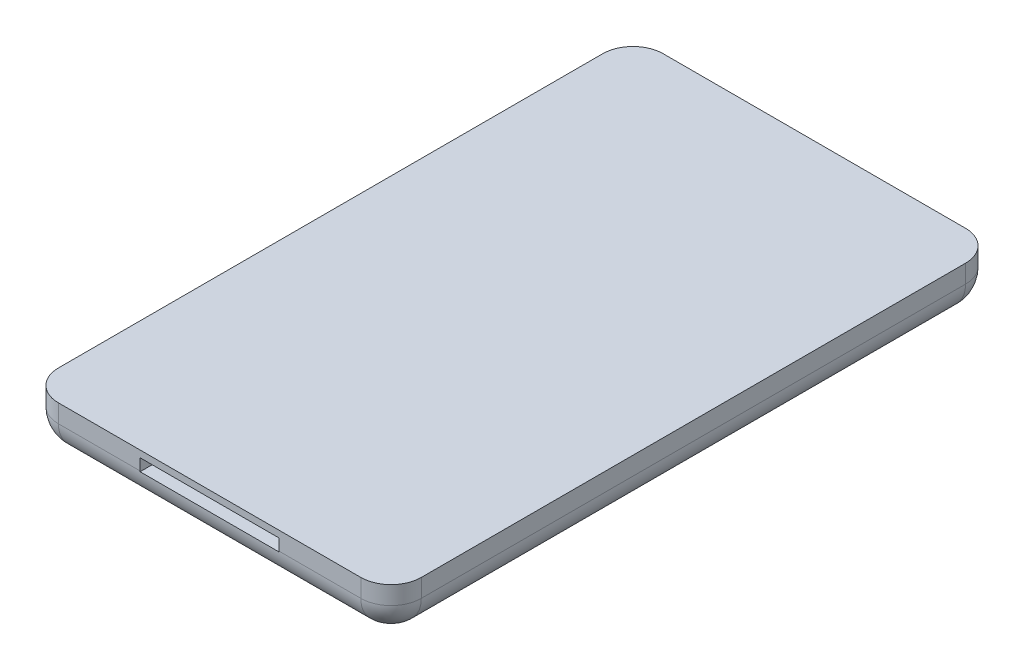
ISO-10303-21;
HEADER;
FILE_DESCRIPTION(('STEP AP214'),'2;1');
FILE_NAME('part.step','',(''),(''),'','','');
FILE_SCHEMA(('AUTOMOTIVE_DESIGN { 1 0 10303 214 1 1 1 1 }'));
ENDSEC;
DATA;
#1=APPLICATION_CONTEXT('core data for automotive mechanical design processes');
#2=APPLICATION_PROTOCOL_DEFINITION('international standard','automotive_design',2000,#1);
#3=PRODUCT_CONTEXT('',#1,'mechanical');
#4=PRODUCT('Part','Part','',(#3));
#5=PRODUCT_RELATED_PRODUCT_CATEGORY('part','',(#4));
#6=PRODUCT_DEFINITION_FORMATION('','',#4);
#7=PRODUCT_DEFINITION_CONTEXT('part definition',#1,'design');
#8=PRODUCT_DEFINITION('design','',#6,#7);
#9=PRODUCT_DEFINITION_SHAPE('','',#8);
#10=(LENGTH_UNIT() NAMED_UNIT(*) SI_UNIT(.MILLI.,.METRE.));
#11=(NAMED_UNIT(*) PLANE_ANGLE_UNIT() SI_UNIT($,.RADIAN.));
#12=(NAMED_UNIT(*) SI_UNIT($,.STERADIAN.) SOLID_ANGLE_UNIT());
#13=UNCERTAINTY_MEASURE_WITH_UNIT(LENGTH_MEASURE(1.E-05),#10,'distance_accuracy_value','');
#14=(GEOMETRIC_REPRESENTATION_CONTEXT(3) GLOBAL_UNCERTAINTY_ASSIGNED_CONTEXT((#13)) GLOBAL_UNIT_ASSIGNED_CONTEXT((#10,
#11,#12)) REPRESENTATION_CONTEXT('',''));
#15=CARTESIAN_POINT('',(0.,0.,0.));
#16=DIRECTION('',(0.,0.,1.));
#17=DIRECTION('',(1.,0.,0.));
#18=AXIS2_PLACEMENT_3D('',#15,#16,#17);
#19=CARTESIAN_POINT('',(-25.,1.,45.));
#20=DIRECTION('',(0.,1.,0.));
#21=DIRECTION('',(0.,0.,1.));
#22=AXIS2_PLACEMENT_3D('',#19,#20,#21);
#23=SPHERICAL_SURFACE('',#22,5.);
#24=CARTESIAN_POINT('',(-25.,1.,45.));
#25=DIRECTION('',(0.,0.,-1.));
#26=DIRECTION('',(-1.,0.,0.));
#27=AXIS2_PLACEMENT_3D('',#24,#25,#26);
#28=CIRCLE('',#27,5.);
#29=CARTESIAN_POINT('',(-25.,-4.,45.));
#30=VERTEX_POINT('',#29);
#31=CARTESIAN_POINT('',(-30.,1.,45.));
#32=VERTEX_POINT('',#31);
#33=EDGE_CURVE('E395',#30,#32,#28,.T.);
#34=ORIENTED_EDGE('',*,*,#33,.F.);
#35=CARTESIAN_POINT('',(-25.,1.,45.));
#36=DIRECTION('',(-1.,0.,0.));
#37=DIRECTION('',(0.,0.,1.));
#38=AXIS2_PLACEMENT_3D('',#35,#36,#37);
#39=CIRCLE('',#38,5.);
#40=CARTESIAN_POINT('',(-25.,1.,50.));
#41=VERTEX_POINT('',#40);
#42=EDGE_CURVE('E393',#30,#41,#39,.T.);
#43=ORIENTED_EDGE('',*,*,#42,.T.);
#44=CARTESIAN_POINT('',(-25.,1.,45.));
#45=DIRECTION('',(0.,-1.,0.));
#46=DIRECTION('',(0.,0.,-1.));
#47=AXIS2_PLACEMENT_3D('',#44,#45,#46);
#48=CIRCLE('',#47,5.);
#49=EDGE_CURVE('E377',#32,#41,#48,.F.);
#50=ORIENTED_EDGE('',*,*,#49,.F.);
#51=EDGE_LOOP('',(#34,#43,#50));
#52=FACE_BOUND('',#51,.T.);
#53=ADVANCED_FACE('F41',(#52),#23,.T.);
#54=CARTESIAN_POINT('',(25.,1.,45.));
#55=DIRECTION('',(-1.,0.,0.));
#56=DIRECTION('',(0.,0.,1.));
#57=AXIS2_PLACEMENT_3D('',#54,#55,#56);
#58=CYLINDRICAL_SURFACE('',#57,5.);
#59=CARTESIAN_POINT('',(-11.5,1.,45.));
#60=DIRECTION('',(-1.,0.,0.));
#61=DIRECTION('',(0.,0.,1.));
#62=AXIS2_PLACEMENT_3D('',#59,#60,#61);
#63=CIRCLE('',#62,5.);
#64=CARTESIAN_POINT('',(-11.5,1.,50.));
#65=VERTEX_POINT('',#64);
#66=CARTESIAN_POINT('',(-11.5,0.884621544444315,49.9986686039378));
#67=VERTEX_POINT('',#66);
#68=EDGE_CURVE('E298',#65,#67,#63,.F.);
#69=ORIENTED_EDGE('',*,*,#68,.F.);
#70=DIRECTION('',(-1.,0.,0.));
#71=VECTOR('',#70,1.);
#72=CARTESIAN_POINT('',(25.,1.,50.));
#73=LINE('',#72,#71);
#74=EDGE_CURVE('E374',#41,#65,#73,.F.);
#75=ORIENTED_EDGE('',*,*,#74,.F.);
#76=ORIENTED_EDGE('',*,*,#42,.F.);
#77=DIRECTION('',(-1.,0.,0.));
#78=VECTOR('',#77,1.);
#79=CARTESIAN_POINT('',(25.,-4.,45.));
#80=LINE('',#79,#78);
#81=CARTESIAN_POINT('',(25.,-4.,45.));
#82=VERTEX_POINT('',#81);
#83=EDGE_CURVE('E341',#82,#30,#80,.T.);
#84=ORIENTED_EDGE('',*,*,#83,.F.);
#85=CARTESIAN_POINT('',(25.,1.,45.));
#86=DIRECTION('',(-1.,0.,0.));
#87=DIRECTION('',(0.,0.,1.));
#88=AXIS2_PLACEMENT_3D('',#85,#86,#87);
#89=CIRCLE('',#88,5.);
#90=CARTESIAN_POINT('',(25.,1.,50.));
#91=VERTEX_POINT('',#90);
#92=EDGE_CURVE('E390',#82,#91,#89,.T.);
#93=ORIENTED_EDGE('',*,*,#92,.T.);
#94=CARTESIAN_POINT('',(11.5,1.,50.));
#95=VERTEX_POINT('',#94);
#96=EDGE_CURVE('E373',#95,#91,#73,.F.);
#97=ORIENTED_EDGE('',*,*,#96,.F.);
#98=CARTESIAN_POINT('',(11.5,1.,45.));
#99=DIRECTION('',(1.,0.,0.));
#100=DIRECTION('',(0.,0.,-1.));
#101=AXIS2_PLACEMENT_3D('',#98,#99,#100);
#102=CIRCLE('',#101,5.);
#103=CARTESIAN_POINT('',(11.5,0.884621544444315,49.9986686039378));
#104=VERTEX_POINT('',#103);
#105=EDGE_CURVE('E288',#104,#95,#102,.F.);
#106=ORIENTED_EDGE('',*,*,#105,.F.);
#107=DIRECTION('',(-1.,0.,0.));
#108=VECTOR('',#107,1.);
#109=CARTESIAN_POINT('',(25.,0.884621544444315,49.9986686039378));
#110=LINE('',#109,#108);
#111=EDGE_CURVE('E401',#67,#104,#110,.F.);
#112=ORIENTED_EDGE('',*,*,#111,.F.);
#113=EDGE_LOOP('',(#69,#75,#76,#84,#93,#97,#106,#112));
#114=FACE_BOUND('',#113,.T.);
#115=ADVANCED_FACE('F422',(#114),#58,.T.);
#116=CARTESIAN_POINT('',(25.,1.,45.));
#117=DIRECTION('',(0.,1.,0.));
#118=DIRECTION('',(0.,0.,1.));
#119=AXIS2_PLACEMENT_3D('',#116,#117,#118);
#120=SPHERICAL_SURFACE('',#119,5.);
#121=ORIENTED_EDGE('',*,*,#92,.F.);
#122=CARTESIAN_POINT('',(25.,1.,45.));
#123=DIRECTION('',(0.,0.,1.));
#124=DIRECTION('',(1.,0.,0.));
#125=AXIS2_PLACEMENT_3D('',#122,#123,#124);
#126=CIRCLE('',#125,5.);
#127=CARTESIAN_POINT('',(30.,1.,45.));
#128=VERTEX_POINT('',#127);
#129=EDGE_CURVE('E388',#82,#128,#126,.T.);
#130=ORIENTED_EDGE('',*,*,#129,.T.);
#131=CARTESIAN_POINT('',(25.,1.,45.));
#132=DIRECTION('',(0.,-1.,0.));
#133=DIRECTION('',(0.,0.,-1.));
#134=AXIS2_PLACEMENT_3D('',#131,#132,#133);
#135=CIRCLE('',#134,5.);
#136=EDGE_CURVE('E370',#91,#128,#135,.F.);
#137=ORIENTED_EDGE('',*,*,#136,.F.);
#138=EDGE_LOOP('',(#121,#130,#137));
#139=FACE_BOUND('',#138,.T.);
#140=ADVANCED_FACE('F427',(#139),#120,.T.);
#141=CARTESIAN_POINT('',(25.,1.,45.));
#142=DIRECTION('',(0.,0.,1.));
#143=DIRECTION('',(1.,0.,0.));
#144=AXIS2_PLACEMENT_3D('',#141,#142,#143);
#145=CYLINDRICAL_SURFACE('',#144,5.);
#146=ORIENTED_EDGE('',*,*,#129,.F.);
#147=DIRECTION('',(0.,0.,1.));
#148=VECTOR('',#147,1.);
#149=CARTESIAN_POINT('',(25.,-4.,45.));
#150=LINE('',#149,#148);
#151=CARTESIAN_POINT('',(25.,-4.,-45.));
#152=VERTEX_POINT('',#151);
#153=EDGE_CURVE('E344',#152,#82,#150,.T.);
#154=ORIENTED_EDGE('',*,*,#153,.F.);
#155=CARTESIAN_POINT('',(25.,1.,-45.));
#156=DIRECTION('',(0.,0.,1.));
#157=DIRECTION('',(1.,0.,0.));
#158=AXIS2_PLACEMENT_3D('',#155,#156,#157);
#159=CIRCLE('',#158,5.);
#160=CARTESIAN_POINT('',(30.,1.,-45.));
#161=VERTEX_POINT('',#160);
#162=EDGE_CURVE('E386',#152,#161,#159,.T.);
#163=ORIENTED_EDGE('',*,*,#162,.T.);
#164=DIRECTION('',(0.,0.,1.));
#165=VECTOR('',#164,1.);
#166=CARTESIAN_POINT('',(30.,1.,45.));
#167=LINE('',#166,#165);
#168=EDGE_CURVE('E367',#128,#161,#167,.F.);
#169=ORIENTED_EDGE('',*,*,#168,.F.);
#170=EDGE_LOOP('',(#146,#154,#163,#169));
#171=FACE_BOUND('',#170,.T.);
#172=ADVANCED_FACE('F440',(#171),#145,.T.);
#173=CARTESIAN_POINT('',(25.,1.,-45.));
#174=DIRECTION('',(0.,1.,0.));
#175=DIRECTION('',(0.,0.,1.));
#176=AXIS2_PLACEMENT_3D('',#173,#174,#175);
#177=SPHERICAL_SURFACE('',#176,5.);
#178=ORIENTED_EDGE('',*,*,#162,.F.);
#179=CARTESIAN_POINT('',(25.,1.,-45.));
#180=DIRECTION('',(1.,0.,0.));
#181=DIRECTION('',(0.,0.,-1.));
#182=AXIS2_PLACEMENT_3D('',#179,#180,#181);
#183=CIRCLE('',#182,5.);
#184=CARTESIAN_POINT('',(25.,1.,-50.));
#185=VERTEX_POINT('',#184);
#186=EDGE_CURVE('E384',#152,#185,#183,.T.);
#187=ORIENTED_EDGE('',*,*,#186,.T.);
#188=CARTESIAN_POINT('',(25.,1.,-45.));
#189=DIRECTION('',(0.,-1.,0.));
#190=DIRECTION('',(0.,0.,-1.));
#191=AXIS2_PLACEMENT_3D('',#188,#189,#190);
#192=CIRCLE('',#191,5.);
#193=EDGE_CURVE('E364',#161,#185,#192,.F.);
#194=ORIENTED_EDGE('',*,*,#193,.F.);
#195=EDGE_LOOP('',(#178,#187,#194));
#196=FACE_BOUND('',#195,.T.);
#197=ADVANCED_FACE('F495',(#196),#177,.T.);
#198=CARTESIAN_POINT('',(25.,1.,-45.));
#199=DIRECTION('',(1.,0.,0.));
#200=DIRECTION('',(0.,0.,-1.));
#201=AXIS2_PLACEMENT_3D('',#198,#199,#200);
#202=CYLINDRICAL_SURFACE('',#201,5.);
#203=ORIENTED_EDGE('',*,*,#186,.F.);
#204=DIRECTION('',(1.,0.,0.));
#205=VECTOR('',#204,1.);
#206=CARTESIAN_POINT('',(25.,-4.,-45.));
#207=LINE('',#206,#205);
#208=CARTESIAN_POINT('',(-25.,-4.,-45.));
#209=VERTEX_POINT('',#208);
#210=EDGE_CURVE('E347',#209,#152,#207,.T.);
#211=ORIENTED_EDGE('',*,*,#210,.F.);
#212=CARTESIAN_POINT('',(-25.,1.,-45.));
#213=DIRECTION('',(1.,0.,0.));
#214=DIRECTION('',(0.,0.,-1.));
#215=AXIS2_PLACEMENT_3D('',#212,#213,#214);
#216=CIRCLE('',#215,5.);
#217=CARTESIAN_POINT('',(-25.,1.,-50.));
#218=VERTEX_POINT('',#217);
#219=EDGE_CURVE('E382',#209,#218,#216,.T.);
#220=ORIENTED_EDGE('',*,*,#219,.T.);
#221=DIRECTION('',(1.,0.,0.));
#222=VECTOR('',#221,1.);
#223=CARTESIAN_POINT('',(25.,1.,-50.));
#224=LINE('',#223,#222);
#225=EDGE_CURVE('E361',#185,#218,#224,.F.);
#226=ORIENTED_EDGE('',*,*,#225,.F.);
#227=EDGE_LOOP('',(#203,#211,#220,#226));
#228=FACE_BOUND('',#227,.T.);
#229=ADVANCED_FACE('F485',(#228),#202,.T.);
#230=CARTESIAN_POINT('',(-25.,1.,-45.));
#231=DIRECTION('',(0.,1.,0.));
#232=DIRECTION('',(0.,0.,1.));
#233=AXIS2_PLACEMENT_3D('',#230,#231,#232);
#234=SPHERICAL_SURFACE('',#233,5.);
#235=ORIENTED_EDGE('',*,*,#219,.F.);
#236=CARTESIAN_POINT('',(-25.,1.,-45.));
#237=DIRECTION('',(0.,0.,-1.));
#238=DIRECTION('',(-1.,0.,0.));
#239=AXIS2_PLACEMENT_3D('',#236,#237,#238);
#240=CIRCLE('',#239,5.);
#241=CARTESIAN_POINT('',(-30.,1.,-45.));
#242=VERTEX_POINT('',#241);
#243=EDGE_CURVE('E380',#209,#242,#240,.T.);
#244=ORIENTED_EDGE('',*,*,#243,.T.);
#245=CARTESIAN_POINT('',(-25.,1.,-45.));
#246=DIRECTION('',(0.,-1.,0.));
#247=DIRECTION('',(0.,0.,-1.));
#248=AXIS2_PLACEMENT_3D('',#245,#246,#247);
#249=CIRCLE('',#248,5.);
#250=EDGE_CURVE('E357',#218,#242,#249,.F.);
#251=ORIENTED_EDGE('',*,*,#250,.F.);
#252=EDGE_LOOP('',(#235,#244,#251));
#253=FACE_BOUND('',#252,.T.);
#254=ADVANCED_FACE('F481',(#253),#234,.T.);
#255=CARTESIAN_POINT('',(-25.,1.,45.));
#256=DIRECTION('',(0.,0.,-1.));
#257=DIRECTION('',(-1.,0.,0.));
#258=AXIS2_PLACEMENT_3D('',#255,#256,#257);
#259=CYLINDRICAL_SURFACE('',#258,5.);
#260=CARTESIAN_POINT('',(-30.,1.,32.65));
#261=CARTESIAN_POINT('',(-30.0000027761331,0.958776922610018,32.6499992591257));
#262=CARTESIAN_POINT('',(-29.9994895839808,0.917574442901752,32.651700439264));
#263=CARTESIAN_POINT('',(-29.997460877049,0.835481269133052,32.658480415993));
#264=CARTESIAN_POINT('',(-29.9959455611979,0.794590514822206,32.6635585422377));
#265=CARTESIAN_POINT('',(-29.9899538133175,0.673036698223798,32.6837751753036));
#266=CARTESIAN_POINT('',(-29.9840311860655,0.593214841357285,32.7038963492236));
#267=CARTESIAN_POINT('',(-29.9689567868141,0.438265461565733,32.7567428791412));
#268=CARTESIAN_POINT('',(-29.9598057111464,0.363136930464891,32.7894655173163));
#269=CARTESIAN_POINT('',(-29.9392243551907,0.219399214308153,32.8665230946765));
#270=CARTESIAN_POINT('',(-29.9277931142383,0.150792795156504,32.9108629308205));
#271=CARTESIAN_POINT('',(-29.9035079627265,0.0201303046063674,33.0112215664061));
#272=CARTESIAN_POINT('',(-29.8906250718143,-0.0417124952522016,33.0675108687189));
#273=CARTESIAN_POINT('',(-29.8650594866836,-0.155244221217956,33.1896036263606));
#274=CARTESIAN_POINT('',(-29.8523768455642,-0.206930494423074,33.2554095596784));
#275=CARTESIAN_POINT('',(-29.8283369878193,-0.299816639058915,33.3964938312308));
#276=CARTESIAN_POINT('',(-29.8170165736178,-0.340750620740782,33.4719538970685));
#277=CARTESIAN_POINT('',(-29.7974298503745,-0.409234823734526,33.629054827348));
#278=CARTESIAN_POINT('',(-29.7891606683556,-0.436797642793349,33.710689789892));
#279=CARTESIAN_POINT('',(-29.7786284551737,-0.471371736726713,33.8522679187996));
#280=CARTESIAN_POINT('',(-29.7753035034845,-0.482084425942488,33.911253699657));
#281=CARTESIAN_POINT('',(-29.7708262463819,-0.496406268542619,34.0301473910673));
#282=CARTESIAN_POINT('',(-29.7696734589847,-0.500016997796097,34.0900550940789));
#283=CARTESIAN_POINT('',(-29.7696960070847,-0.5,34.15));
#284=B_SPLINE_CURVE_WITH_KNOTS('',3,(#260,#261,#262,#263,#264,#265,#266,#267,#268,#269,#270,
#271,#272,#273,#274,#275,#276,#277,#278,#279,#280,#281,#282,#283),.UNSPECIFIED.,.F.,.F.,(4,2,2,
2,2,2,2,2,2,2,2,4),(0.,0.123590522760266,0.247156519315276,0.493467728235495,0.739725843675753,
0.986087930955973,1.23877207809718,1.49152213929098,1.75003354782293,2.00830092246139,
2.18798745648377,2.36763411497588),.UNSPECIFIED.);
#285=CARTESIAN_POINT('',(-30.,1.,32.65));
#286=VERTEX_POINT('',#285);
#287=CARTESIAN_POINT('',(-29.7696960070847,-0.500000000000001,34.15));
#288=VERTEX_POINT('',#287);
#289=EDGE_CURVE('E190',#286,#288,#284,.T.);
#290=ORIENTED_EDGE('',*,*,#289,.F.);
#291=DIRECTION('',(0.,0.,-1.));
#292=VECTOR('',#291,1.);
#293=CARTESIAN_POINT('',(-30.,1.,45.));
#294=LINE('',#293,#292);
#295=CARTESIAN_POINT('',(-30.,1.,-41.5));
#296=VERTEX_POINT('',#295);
#297=EDGE_CURVE('E358',#296,#286,#294,.F.);
#298=ORIENTED_EDGE('',*,*,#297,.F.);
#299=CARTESIAN_POINT('',(-30.,1.,-44.5));
#300=CARTESIAN_POINT('',(-30.0000027754012,0.958778314862085,-44.5000007408823));
#301=CARTESIAN_POINT('',(-29.9994896183604,0.917577227638924,-44.4982996758482));
#302=CARTESIAN_POINT('',(-29.9974610481492,0.835486802900169,-44.4915201559506));
#303=CARTESIAN_POINT('',(-29.9959458337721,0.794597405177129,-44.4864423709777));
#304=CARTESIAN_POINT('',(-29.9899542125827,0.67304210297741,-44.4662261862327));
#305=CARTESIAN_POINT('',(-29.9840314412901,0.593217463777063,-44.4461045537268));
#306=CARTESIAN_POINT('',(-29.9689566693926,0.438264255620624,-44.3932567010085));
#307=CARTESIAN_POINT('',(-29.9598054241947,0.363134592957951,-44.3605334291972));
#308=CARTESIAN_POINT('',(-29.9392240035669,0.219397094339689,-44.2834755691745));
#309=CARTESIAN_POINT('',(-29.927792937817,0.150791821808579,-44.2391364425884));
#310=CARTESIAN_POINT('',(-29.9035077336612,0.0201290969167441,-44.1387773818743));
#311=CARTESIAN_POINT('',(-29.8906245758525,-0.0417148050815755,-44.0824865754726));
#312=CARTESIAN_POINT('',(-29.8650590639476,-0.1552459876862,-43.9603945458));
#313=CARTESIAN_POINT('',(-29.8523767556974,-0.206930979280846,-43.894591184938));
#314=CARTESIAN_POINT('',(-29.8283408570241,-0.29980154835302,-43.7535275756083));
#315=CARTESIAN_POINT('',(-29.817023539123,-0.340725020921291,-43.6780880108157));
#316=CARTESIAN_POINT('',(-29.7974358161108,-0.409215217889649,-43.5210069335591));
#317=CARTESIAN_POINT('',(-29.7891645379063,-0.436785770382754,-43.4393672063673));
#318=CARTESIAN_POINT('',(-29.7769087740644,-0.477016126605903,-43.2746106142854));
#319=CARTESIAN_POINT('',(-29.7728107811589,-0.49007168229999,-43.1915990543076));
#320=CARTESIAN_POINT('',(-29.7690278915525,-0.50213732483116,-43.0244686646846));
#321=CARTESIAN_POINT('',(-29.769342020733,-0.501150511974064,-42.9403500835473));
#322=CARTESIAN_POINT('',(-29.7742474537349,-0.485469731742364,-42.7766156510914));
#323=CARTESIAN_POINT('',(-29.7786839348678,-0.471271902086283,-42.6969468780719));
#324=CARTESIAN_POINT('',(-29.7910836490166,-0.43037390734878,-42.5411793811285));
#325=CARTESIAN_POINT('',(-29.7990471916409,-0.403672644693496,-42.4650809712628));
#326=CARTESIAN_POINT('',(-29.8177273936713,-0.338160066401405,-42.317399156507));
#327=CARTESIAN_POINT('',(-29.8284803054067,-0.29918772304939,-42.2458919664135));
#328=CARTESIAN_POINT('',(-29.8515100338156,-0.210351484292359,-42.1102671142068));
#329=CARTESIAN_POINT('',(-29.8637871992456,-0.160485094287376,-42.0461511497373));
#330=CARTESIAN_POINT('',(-29.8891088821421,-0.0488186325643929,-41.9243197597647));
#331=CARTESIAN_POINT('',(-29.902164057606,0.0133921169164269,-41.8669823578954));
#332=CARTESIAN_POINT('',(-29.927120151179,0.146724207419392,-41.7634548006818));
#333=CARTESIAN_POINT('',(-29.9390207757223,0.217847804215803,-41.7172674760286));
#334=CARTESIAN_POINT('',(-29.9604380370788,0.367685694627247,-41.637116353122));
#335=CARTESIAN_POINT('',(-29.9699368896035,0.446450961017642,-41.6032429719674));
#336=CARTESIAN_POINT('',(-29.9853421870739,0.608869934243135,-41.5493755201721));
#337=CARTESIAN_POINT('',(-29.9912538877992,0.692516291378529,-41.5293611376674));
#338=CARTESIAN_POINT('',(-29.9966812194892,0.814116270824638,-41.5110928798455));
#339=CARTESIAN_POINT('',(-29.997923491944,0.851188538166992,-41.5069333347348));
#340=CARTESIAN_POINT('',(-29.9995828189052,0.925500982593438,-41.5013894699638));
#341=CARTESIAN_POINT('',(-30.0000011390009,0.962740813965639,-41.5000008940572));
#342=CARTESIAN_POINT('',(-30.,0.999999999999992,-41.5));
#343=B_SPLINE_CURVE_WITH_KNOTS('',3,(#299,#300,#301,#302,#303,#304,#305,#306,#307,#308,#309,
#310,#311,#312,#313,#314,#315,#316,#317,#318,#319,#320,#321,#322,#323,#324,#325,#326,#327,#328,
#329,#330,#331,#332,#333,#334,#335,#336,#337,#338,#339,#340,#341,#342),.UNSPECIFIED.,.F.,.F.,(4,
2,2,2,2,2,2,2,2,2,2,2,2,2,2,2,2,2,2,2,2,4),(0.,0.123586349299501,0.247148188235244,
0.493467705903282,0.739729627259747,0.986087908292363,1.23877657706038,1.4915221166828,
1.74994856887332,2.00830088994152,2.25942192987993,2.51048752760879,2.75248923057986,
2.99451218087957,3.23985364377019,3.4852513457732,3.74087441324125,3.9965623081359,
4.25409142087118,4.5112422933419,4.62312535209808,4.7348364242684),.UNSPECIFIED.);
#344=CARTESIAN_POINT('',(-30.,1.,-44.5));
#345=VERTEX_POINT('',#344);
#346=EDGE_CURVE('E62',#345,#296,#343,.T.);
#347=ORIENTED_EDGE('',*,*,#346,.F.);
#348=EDGE_CURVE('E354',#242,#345,#294,.F.);
#349=ORIENTED_EDGE('',*,*,#348,.F.);
#350=ORIENTED_EDGE('',*,*,#243,.F.);
#351=DIRECTION('',(0.,0.,-1.));
#352=VECTOR('',#351,1.);
#353=CARTESIAN_POINT('',(-25.,-4.,45.));
#354=LINE('',#353,#352);
#355=EDGE_CURVE('E350',#30,#209,#354,.T.);
#356=ORIENTED_EDGE('',*,*,#355,.F.);
#357=ORIENTED_EDGE('',*,*,#33,.T.);
#358=CARTESIAN_POINT('',(-30.,1.,44.65));
#359=VERTEX_POINT('',#358);
#360=EDGE_CURVE('E353',#359,#32,#294,.F.);
#361=ORIENTED_EDGE('',*,*,#360,.F.);
#362=CARTESIAN_POINT('',(-29.7696960070847,-0.499999999999998,43.15));
#363=CARTESIAN_POINT('',(-29.7696924899309,-0.500000853599865,43.1911808106762));
#364=CARTESIAN_POINT('',(-29.7702300066372,-0.498303053746315,43.2323408788447));
#365=CARTESIAN_POINT('',(-29.7723511334335,-0.491537274812785,43.3143467968877));
#366=CARTESIAN_POINT('',(-29.7739345082043,-0.486470053854629,43.3551927153553));
#367=CARTESIAN_POINT('',(-29.7801853300217,-0.46630065235378,43.4765960437531));
#368=CARTESIAN_POINT('',(-29.7863539730558,-0.446230286371512,43.5563090603428));
#369=CARTESIAN_POINT('',(-29.8019593903749,-0.393531473359058,43.7110342812272));
#370=CARTESIAN_POINT('',(-29.8113950786453,-0.36090719903445,43.7860480378529));
#371=CARTESIAN_POINT('',(-29.8324653260204,-0.28407985018232,43.9295943991032));
#372=CARTESIAN_POINT('',(-29.8441009806121,-0.239871002793117,43.9981237491581));
#373=CARTESIAN_POINT('',(-29.8686681820043,-0.139649308937021,44.1288651690351));
#374=CARTESIAN_POINT('',(-29.8816271848348,-0.0833363360798506,44.1908419504997));
#375=CARTESIAN_POINT('',(-29.9071478179685,0.0388598860967976,44.304634317974));
#376=CARTESIAN_POINT('',(-29.9197093703538,0.104744997994952,44.3564479217769));
#377=CARTESIAN_POINT('',(-29.9433359243422,0.245909839774587,44.4494777771676));
#378=CARTESIAN_POINT('',(-29.9543640012881,0.321357661922012,44.490448903112));
#379=CARTESIAN_POINT('',(-29.9733500520275,0.478436630949659,44.5590067307582));
#380=CARTESIAN_POINT('',(-29.9813106841501,0.560062350158339,44.5866050270758));
#381=CARTESIAN_POINT('',(-29.9914371003886,0.701735543978305,44.6212689611271));
#382=CARTESIAN_POINT('',(-29.9946276473893,0.760833509331214,44.6320213658736));
#383=CARTESIAN_POINT('',(-29.998918178526,0.879942608580982,44.6463940173578));
#384=CARTESIAN_POINT('',(-30.0000188888958,0.939953417947497,44.6500167417284));
#385=CARTESIAN_POINT('',(-30.,1.,44.65));
#386=B_SPLINE_CURVE_WITH_KNOTS('',3,(#362,#363,#364,#365,#366,#367,#368,#369,#370,#371,#372,
#373,#374,#375,#376,#377,#378,#379,#380,#381,#382,#383,#384,#385),.UNSPECIFIED.,.F.,.F.,(4,2,2,
2,2,2,2,2,2,2,2,4),(0.,0.123463321048068,0.246898872168483,0.492911372366583,0.738842172727398,
0.984895759946676,1.23795183323011,1.49105721311967,1.74947248420819,2.00766329935825,
2.1876802778492,2.36763468764484),.UNSPECIFIED.);
#387=CARTESIAN_POINT('',(-29.7696960070847,-0.499999999999998,43.15));
#388=VERTEX_POINT('',#387);
#389=EDGE_CURVE('E55',#388,#359,#386,.T.);
#390=ORIENTED_EDGE('',*,*,#389,.F.);
#391=DIRECTION('',(0.,0.,-1.));
#392=VECTOR('',#391,1.);
#393=CARTESIAN_POINT('',(-29.7696960070847,-0.499999999999999,45.));
#394=LINE('',#393,#392);
#395=EDGE_CURVE('E11',#288,#388,#394,.F.);
#396=ORIENTED_EDGE('',*,*,#395,.F.);
#397=EDGE_LOOP('',(#290,#298,#347,#349,#350,#356,#357,#361,#390,#396));
#398=FACE_BOUND('',#397,.T.);
#399=ADVANCED_FACE('F234',(#398),#259,.T.);
#400=CARTESIAN_POINT('',(25.,4.,45.));
#401=DIRECTION('',(0.,-1.,0.));
#402=DIRECTION('',(0.,0.,-1.));
#403=AXIS2_PLACEMENT_3D('',#400,#401,#402);
#404=CYLINDRICAL_SURFACE('',#403,5.);
#405=DIRECTION('',(0.,-1.,0.));
#406=VECTOR('',#405,1.);
#407=CARTESIAN_POINT('',(25.,4.,50.));
#408=LINE('',#407,#406);
#409=CARTESIAN_POINT('',(25.,4.,50.));
#410=VERTEX_POINT('',#409);
#411=EDGE_CURVE('E317',#410,#91,#408,.T.);
#412=ORIENTED_EDGE('',*,*,#411,.T.);
#413=ORIENTED_EDGE('',*,*,#136,.T.);
#414=DIRECTION('',(0.,-1.,0.));
#415=VECTOR('',#414,1.);
#416=CARTESIAN_POINT('',(30.,4.,45.));
#417=LINE('',#416,#415);
#418=CARTESIAN_POINT('',(30.,4.,45.));
#419=VERTEX_POINT('',#418);
#420=EDGE_CURVE('E338',#419,#128,#417,.T.);
#421=ORIENTED_EDGE('',*,*,#420,.F.);
#422=CARTESIAN_POINT('',(25.,4.,45.));
#423=DIRECTION('',(0.,1.,0.));
#424=DIRECTION('',(0.,0.,1.));
#425=AXIS2_PLACEMENT_3D('',#422,#423,#424);
#426=CIRCLE('',#425,5.);
#427=EDGE_CURVE('E300',#410,#419,#426,.T.);
#428=ORIENTED_EDGE('',*,*,#427,.F.);
#429=EDGE_LOOP('',(#412,#413,#421,#428));
#430=FACE_BOUND('',#429,.T.);
#431=ADVANCED_FACE('F446',(#430),#404,.T.);
#432=CARTESIAN_POINT('',(30.,4.,45.));
#433=DIRECTION('',(-1.,0.,0.));
#434=DIRECTION('',(0.,0.,1.));
#435=AXIS2_PLACEMENT_3D('',#432,#433,#434);
#436=PLANE('',#435);
#437=ORIENTED_EDGE('',*,*,#420,.T.);
#438=ORIENTED_EDGE('',*,*,#168,.T.);
#439=DIRECTION('',(0.,-1.,0.));
#440=VECTOR('',#439,1.);
#441=CARTESIAN_POINT('',(30.,4.,-45.));
#442=LINE('',#441,#440);
#443=CARTESIAN_POINT('',(30.,4.,-45.));
#444=VERTEX_POINT('',#443);
#445=EDGE_CURVE('E335',#444,#161,#442,.T.);
#446=ORIENTED_EDGE('',*,*,#445,.F.);
#447=DIRECTION('',(0.,0.,-1.));
#448=VECTOR('',#447,1.);
#449=CARTESIAN_POINT('',(30.,4.,45.));
#450=LINE('',#449,#448);
#451=EDGE_CURVE('E303',#419,#444,#450,.T.);
#452=ORIENTED_EDGE('',*,*,#451,.F.);
#453=EDGE_LOOP('',(#437,#438,#446,#452));
#454=FACE_BOUND('',#453,.T.);
#455=ADVANCED_FACE('F546',(#454),#436,.F.);
#456=CARTESIAN_POINT('',(25.,4.,-45.));
#457=DIRECTION('',(0.,-1.,0.));
#458=DIRECTION('',(0.,0.,-1.));
#459=AXIS2_PLACEMENT_3D('',#456,#457,#458);
#460=CYLINDRICAL_SURFACE('',#459,5.);
#461=ORIENTED_EDGE('',*,*,#445,.T.);
#462=ORIENTED_EDGE('',*,*,#193,.T.);
#463=DIRECTION('',(0.,-1.,0.));
#464=VECTOR('',#463,1.);
#465=CARTESIAN_POINT('',(25.,4.,-50.));
#466=LINE('',#465,#464);
#467=CARTESIAN_POINT('',(25.,4.,-50.));
#468=VERTEX_POINT('',#467);
#469=EDGE_CURVE('E332',#468,#185,#466,.T.);
#470=ORIENTED_EDGE('',*,*,#469,.F.);
#471=CARTESIAN_POINT('',(25.,4.,-45.));
#472=DIRECTION('',(0.,1.,0.));
#473=DIRECTION('',(0.,0.,1.));
#474=AXIS2_PLACEMENT_3D('',#471,#472,#473);
#475=CIRCLE('',#474,5.);
#476=EDGE_CURVE('E305',#444,#468,#475,.T.);
#477=ORIENTED_EDGE('',*,*,#476,.F.);
#478=EDGE_LOOP('',(#461,#462,#470,#477));
#479=FACE_BOUND('',#478,.T.);
#480=ADVANCED_FACE('F491',(#479),#460,.T.);
#481=CARTESIAN_POINT('',(25.,4.,-50.));
#482=DIRECTION('',(0.,0.,1.));
#483=DIRECTION('',(1.,0.,0.));
#484=AXIS2_PLACEMENT_3D('',#481,#482,#483);
#485=PLANE('',#484);
#486=ORIENTED_EDGE('',*,*,#469,.T.);
#487=ORIENTED_EDGE('',*,*,#225,.T.);
#488=DIRECTION('',(0.,-1.,0.));
#489=VECTOR('',#488,1.);
#490=CARTESIAN_POINT('',(-25.,4.,-50.));
#491=LINE('',#490,#489);
#492=CARTESIAN_POINT('',(-25.,4.,-50.));
#493=VERTEX_POINT('',#492);
#494=EDGE_CURVE('E329',#493,#218,#491,.T.);
#495=ORIENTED_EDGE('',*,*,#494,.F.);
#496=DIRECTION('',(-1.,0.,0.));
#497=VECTOR('',#496,1.);
#498=CARTESIAN_POINT('',(25.,4.,-50.));
#499=LINE('',#498,#497);
#500=EDGE_CURVE('E307',#468,#493,#499,.T.);
#501=ORIENTED_EDGE('',*,*,#500,.F.);
#502=EDGE_LOOP('',(#486,#487,#495,#501));
#503=FACE_BOUND('',#502,.T.);
#504=ADVANCED_FACE('F487',(#503),#485,.F.);
#505=CARTESIAN_POINT('',(-25.,4.,-45.));
#506=DIRECTION('',(0.,-1.,0.));
#507=DIRECTION('',(0.,0.,-1.));
#508=AXIS2_PLACEMENT_3D('',#505,#506,#507);
#509=CYLINDRICAL_SURFACE('',#508,5.);
#510=ORIENTED_EDGE('',*,*,#494,.T.);
#511=ORIENTED_EDGE('',*,*,#250,.T.);
#512=DIRECTION('',(0.,-1.,0.));
#513=VECTOR('',#512,1.);
#514=CARTESIAN_POINT('',(-30.,4.,-45.));
#515=LINE('',#514,#513);
#516=CARTESIAN_POINT('',(-30.,4.,-45.));
#517=VERTEX_POINT('',#516);
#518=EDGE_CURVE('E326',#517,#242,#515,.T.);
#519=ORIENTED_EDGE('',*,*,#518,.F.);
#520=CARTESIAN_POINT('',(-25.,4.,-45.));
#521=DIRECTION('',(0.,1.,0.));
#522=DIRECTION('',(0.,0.,1.));
#523=AXIS2_PLACEMENT_3D('',#520,#521,#522);
#524=CIRCLE('',#523,5.);
#525=EDGE_CURVE('E309',#493,#517,#524,.T.);
#526=ORIENTED_EDGE('',*,*,#525,.F.);
#527=EDGE_LOOP('',(#510,#511,#519,#526));
#528=FACE_BOUND('',#527,.T.);
#529=ADVANCED_FACE('F478',(#528),#509,.T.);
#530=CARTESIAN_POINT('',(-30.,4.,45.));
#531=DIRECTION('',(1.,0.,0.));
#532=DIRECTION('',(0.,0.,-1.));
#533=AXIS2_PLACEMENT_3D('',#530,#531,#532);
#534=PLANE('',#533);
#535=ORIENTED_EDGE('',*,*,#297,.T.);
#536=CARTESIAN_POINT('',(-30.,1.,34.15));
#537=DIRECTION('',(-1.,0.,0.));
#538=DIRECTION('',(0.,0.,1.));
#539=AXIS2_PLACEMENT_3D('',#536,#537,#538);
#540=CIRCLE('',#539,1.5);
#541=CARTESIAN_POINT('',(-30.,2.5,34.15));
#542=VERTEX_POINT('',#541);
#543=EDGE_CURVE('E209',#542,#286,#540,.T.);
#544=ORIENTED_EDGE('',*,*,#543,.F.);
#545=DIRECTION('',(0.,0.,-1.));
#546=VECTOR('',#545,1.);
#547=CARTESIAN_POINT('',(-30.,2.5,34.15));
#548=LINE('',#547,#546);
#549=CARTESIAN_POINT('',(-30.,2.5,43.15));
#550=VERTEX_POINT('',#549);
#551=EDGE_CURVE('E206',#550,#542,#548,.T.);
#552=ORIENTED_EDGE('',*,*,#551,.F.);
#553=CARTESIAN_POINT('',(-30.,1.,43.15));
#554=DIRECTION('',(1.,0.,0.));
#555=DIRECTION('',(0.,0.,-1.));
#556=AXIS2_PLACEMENT_3D('',#553,#554,#555);
#557=CIRCLE('',#556,1.5);
#558=EDGE_CURVE('E48',#550,#359,#557,.T.);
#559=ORIENTED_EDGE('',*,*,#558,.T.);
#560=ORIENTED_EDGE('',*,*,#360,.T.);
#561=DIRECTION('',(0.,-1.,0.));
#562=VECTOR('',#561,1.);
#563=CARTESIAN_POINT('',(-30.,4.,45.));
#564=LINE('',#563,#562);
#565=CARTESIAN_POINT('',(-30.,4.,45.));
#566=VERTEX_POINT('',#565);
#567=EDGE_CURVE('E323',#566,#32,#564,.T.);
#568=ORIENTED_EDGE('',*,*,#567,.F.);
#569=DIRECTION('',(0.,0.,1.));
#570=VECTOR('',#569,1.);
#571=CARTESIAN_POINT('',(-30.,4.,45.));
#572=LINE('',#571,#570);
#573=EDGE_CURVE('E311',#517,#566,#572,.T.);
#574=ORIENTED_EDGE('',*,*,#573,.F.);
#575=ORIENTED_EDGE('',*,*,#518,.T.);
#576=ORIENTED_EDGE('',*,*,#348,.T.);
#577=CARTESIAN_POINT('',(-30.,1.,-43.));
#578=DIRECTION('',(-1.,0.,0.));
#579=DIRECTION('',(0.,0.,1.));
#580=AXIS2_PLACEMENT_3D('',#577,#578,#579);
#581=CIRCLE('',#580,1.5);
#582=EDGE_CURVE('E268',#296,#345,#581,.T.);
#583=ORIENTED_EDGE('',*,*,#582,.F.);
#584=EDGE_LOOP('',(#535,#544,#552,#559,#560,#568,#574,#575,#576,#583));
#585=FACE_BOUND('',#584,.T.);
#586=ADVANCED_FACE('F406',(#585),#534,.F.);
#587=CARTESIAN_POINT('',(-25.,4.,45.));
#588=DIRECTION('',(0.,-1.,0.));
#589=DIRECTION('',(0.,0.,-1.));
#590=AXIS2_PLACEMENT_3D('',#587,#588,#589);
#591=CYLINDRICAL_SURFACE('',#590,5.);
#592=ORIENTED_EDGE('',*,*,#567,.T.);
#593=ORIENTED_EDGE('',*,*,#49,.T.);
#594=DIRECTION('',(0.,-1.,0.));
#595=VECTOR('',#594,1.);
#596=CARTESIAN_POINT('',(-25.,4.,50.));
#597=LINE('',#596,#595);
#598=CARTESIAN_POINT('',(-25.,4.,50.));
#599=VERTEX_POINT('',#598);
#600=EDGE_CURVE('E320',#599,#41,#597,.T.);
#601=ORIENTED_EDGE('',*,*,#600,.F.);
#602=CARTESIAN_POINT('',(-25.,4.,45.));
#603=DIRECTION('',(0.,1.,0.));
#604=DIRECTION('',(0.,0.,-1.));
#605=AXIS2_PLACEMENT_3D('',#602,#603,#604);
#606=CIRCLE('',#605,5.);
#607=EDGE_CURVE('E313',#566,#599,#606,.T.);
#608=ORIENTED_EDGE('',*,*,#607,.F.);
#609=EDGE_LOOP('',(#592,#593,#601,#608));
#610=FACE_BOUND('',#609,.T.);
#611=ADVANCED_FACE('F469',(#610),#591,.T.);
#612=CARTESIAN_POINT('',(25.,4.,50.));
#613=DIRECTION('',(0.,0.,-1.));
#614=DIRECTION('',(-1.,0.,0.));
#615=AXIS2_PLACEMENT_3D('',#612,#613,#614);
#616=PLANE('',#615);
#617=ORIENTED_EDGE('',*,*,#74,.T.);
#618=DIRECTION('',(0.,-1.,0.));
#619=VECTOR('',#618,1.);
#620=CARTESIAN_POINT('',(-11.5,0.884621544444315,50.));
#621=LINE('',#620,#619);
#622=CARTESIAN_POINT('',(-11.5,2.88462154444432,50.));
#623=VERTEX_POINT('',#622);
#624=EDGE_CURVE('E266',#623,#65,#621,.T.);
#625=ORIENTED_EDGE('',*,*,#624,.F.);
#626=DIRECTION('',(-1.,0.,0.));
#627=VECTOR('',#626,1.);
#628=CARTESIAN_POINT('',(-11.5,2.88462154444432,50.));
#629=LINE('',#628,#627);
#630=CARTESIAN_POINT('',(11.5,2.88462154444432,50.));
#631=VERTEX_POINT('',#630);
#632=EDGE_CURVE('E273',#631,#623,#629,.T.);
#633=ORIENTED_EDGE('',*,*,#632,.F.);
#634=DIRECTION('',(0.,-1.,0.));
#635=VECTOR('',#634,1.);
#636=CARTESIAN_POINT('',(11.5,4.,50.));
#637=LINE('',#636,#635);
#638=EDGE_CURVE('E398',#631,#95,#637,.T.);
#639=ORIENTED_EDGE('',*,*,#638,.T.);
#640=ORIENTED_EDGE('',*,*,#96,.T.);
#641=ORIENTED_EDGE('',*,*,#411,.F.);
#642=DIRECTION('',(1.,0.,0.));
#643=VECTOR('',#642,1.);
#644=CARTESIAN_POINT('',(25.,4.,50.));
#645=LINE('',#644,#643);
#646=EDGE_CURVE('E315',#599,#410,#645,.T.);
#647=ORIENTED_EDGE('',*,*,#646,.F.);
#648=ORIENTED_EDGE('',*,*,#600,.T.);
#649=EDGE_LOOP('',(#617,#625,#633,#639,#640,#641,#647,#648));
#650=FACE_BOUND('',#649,.T.);
#651=ADVANCED_FACE('F451',(#650),#616,.F.);
#652=CARTESIAN_POINT('',(25.,4.,45.));
#653=DIRECTION('',(0.,1.,0.));
#654=DIRECTION('',(0.,0.,1.));
#655=AXIS2_PLACEMENT_3D('',#652,#653,#654);
#656=PLANE('',#655);
#657=ORIENTED_EDGE('',*,*,#427,.T.);
#658=ORIENTED_EDGE('',*,*,#451,.T.);
#659=ORIENTED_EDGE('',*,*,#476,.T.);
#660=ORIENTED_EDGE('',*,*,#500,.T.);
#661=ORIENTED_EDGE('',*,*,#525,.T.);
#662=ORIENTED_EDGE('',*,*,#573,.T.);
#663=ORIENTED_EDGE('',*,*,#607,.T.);
#664=ORIENTED_EDGE('',*,*,#646,.T.);
#665=EDGE_LOOP('',(#657,#658,#659,#660,#661,#662,#663,#664));
#666=FACE_BOUND('',#665,.T.);
#667=ADVANCED_FACE('F473',(#666),#656,.T.);
#668=CARTESIAN_POINT('',(25.,-4.,45.));
#669=DIRECTION('',(0.,1.,0.));
#670=DIRECTION('',(0.,0.,1.));
#671=AXIS2_PLACEMENT_3D('',#668,#669,#670);
#672=PLANE('',#671);
#673=ORIENTED_EDGE('',*,*,#83,.T.);
#674=ORIENTED_EDGE('',*,*,#355,.T.);
#675=ORIENTED_EDGE('',*,*,#210,.T.);
#676=ORIENTED_EDGE('',*,*,#153,.T.);
#677=EDGE_LOOP('',(#673,#674,#675,#676));
#678=FACE_BOUND('',#677,.T.);
#679=ADVANCED_FACE('F436',(#678),#672,.F.);
#680=CARTESIAN_POINT('',(-11.5,0.884621544444315,47.));
#681=DIRECTION('',(-1.,0.,0.));
#682=DIRECTION('',(0.,0.,1.));
#683=AXIS2_PLACEMENT_3D('',#680,#681,#682);
#684=PLANE('',#683);
#685=ORIENTED_EDGE('',*,*,#68,.T.);
#686=DIRECTION('',(0.,0.,1.));
#687=VECTOR('',#686,1.);
#688=CARTESIAN_POINT('',(-11.5,0.884621544444315,47.));
#689=LINE('',#688,#687);
#690=CARTESIAN_POINT('',(-11.5,0.884621544444315,47.));
#691=VERTEX_POINT('',#690);
#692=EDGE_CURVE('E282',#691,#67,#689,.T.);
#693=ORIENTED_EDGE('',*,*,#692,.F.);
#694=DIRECTION('',(0.,-1.,0.));
#695=VECTOR('',#694,1.);
#696=CARTESIAN_POINT('',(-11.5,0.884621544444315,47.));
#697=LINE('',#696,#695);
#698=CARTESIAN_POINT('',(-11.5,2.88462154444432,47.));
#699=VERTEX_POINT('',#698);
#700=EDGE_CURVE('E269',#699,#691,#697,.T.);
#701=ORIENTED_EDGE('',*,*,#700,.F.);
#702=DIRECTION('',(0.,0.,1.));
#703=VECTOR('',#702,1.);
#704=CARTESIAN_POINT('',(-11.5,2.88462154444432,47.));
#705=LINE('',#704,#703);
#706=EDGE_CURVE('E286',#699,#623,#705,.T.);
#707=ORIENTED_EDGE('',*,*,#706,.T.);
#708=ORIENTED_EDGE('',*,*,#624,.T.);
#709=EDGE_LOOP('',(#685,#693,#701,#707,#708));
#710=FACE_BOUND('',#709,.T.);
#711=ADVANCED_FACE('F464',(#710),#684,.F.);
#712=CARTESIAN_POINT('',(-11.5,2.88462154444432,47.));
#713=DIRECTION('',(0.,1.,0.));
#714=DIRECTION('',(0.,0.,1.));
#715=AXIS2_PLACEMENT_3D('',#712,#713,#714);
#716=PLANE('',#715);
#717=ORIENTED_EDGE('',*,*,#632,.T.);
#718=ORIENTED_EDGE('',*,*,#706,.F.);
#719=DIRECTION('',(-1.,0.,0.));
#720=VECTOR('',#719,1.);
#721=CARTESIAN_POINT('',(-11.5,2.88462154444432,47.));
#722=LINE('',#721,#720);
#723=CARTESIAN_POINT('',(11.5,2.88462154444432,47.));
#724=VERTEX_POINT('',#723);
#725=EDGE_CURVE('E279',#724,#699,#722,.T.);
#726=ORIENTED_EDGE('',*,*,#725,.F.);
#727=DIRECTION('',(0.,0.,1.));
#728=VECTOR('',#727,1.);
#729=CARTESIAN_POINT('',(11.5,2.88462154444432,47.));
#730=LINE('',#729,#728);
#731=EDGE_CURVE('E289',#724,#631,#730,.T.);
#732=ORIENTED_EDGE('',*,*,#731,.T.);
#733=EDGE_LOOP('',(#717,#718,#726,#732));
#734=FACE_BOUND('',#733,.T.);
#735=ADVANCED_FACE('F629',(#734),#716,.F.);
#736=CARTESIAN_POINT('',(11.5,0.884621544444315,47.));
#737=DIRECTION('',(1.,0.,0.));
#738=DIRECTION('',(0.,0.,-1.));
#739=AXIS2_PLACEMENT_3D('',#736,#737,#738);
#740=PLANE('',#739);
#741=ORIENTED_EDGE('',*,*,#105,.T.);
#742=ORIENTED_EDGE('',*,*,#638,.F.);
#743=ORIENTED_EDGE('',*,*,#731,.F.);
#744=DIRECTION('',(0.,1.,0.));
#745=VECTOR('',#744,1.);
#746=CARTESIAN_POINT('',(11.5,0.884621544444315,47.));
#747=LINE('',#746,#745);
#748=CARTESIAN_POINT('',(11.5,0.884621544444315,47.));
#749=VERTEX_POINT('',#748);
#750=EDGE_CURVE('E276',#749,#724,#747,.T.);
#751=ORIENTED_EDGE('',*,*,#750,.F.);
#752=DIRECTION('',(0.,0.,1.));
#753=VECTOR('',#752,1.);
#754=CARTESIAN_POINT('',(11.5,0.884621544444315,47.));
#755=LINE('',#754,#753);
#756=EDGE_CURVE('E292',#749,#104,#755,.T.);
#757=ORIENTED_EDGE('',*,*,#756,.T.);
#758=EDGE_LOOP('',(#741,#742,#743,#751,#757));
#759=FACE_BOUND('',#758,.T.);
#760=ADVANCED_FACE('F457',(#759),#740,.F.);
#761=CARTESIAN_POINT('',(-11.5,0.884621544444315,47.));
#762=DIRECTION('',(0.,-1.,0.));
#763=DIRECTION('',(0.,0.,-1.));
#764=AXIS2_PLACEMENT_3D('',#761,#762,#763);
#765=PLANE('',#764);
#766=ORIENTED_EDGE('',*,*,#111,.T.);
#767=ORIENTED_EDGE('',*,*,#756,.F.);
#768=DIRECTION('',(1.,0.,0.));
#769=VECTOR('',#768,1.);
#770=CARTESIAN_POINT('',(-11.5,0.884621544444315,47.));
#771=LINE('',#770,#769);
#772=EDGE_CURVE('E272',#691,#749,#771,.T.);
#773=ORIENTED_EDGE('',*,*,#772,.F.);
#774=ORIENTED_EDGE('',*,*,#692,.T.);
#775=EDGE_LOOP('',(#766,#767,#773,#774));
#776=FACE_BOUND('',#775,.T.);
#777=ADVANCED_FACE('F461',(#776),#765,.F.);
#778=CARTESIAN_POINT('',(0.,0.,47.));
#779=DIRECTION('',(0.,0.,-1.));
#780=DIRECTION('',(-1.,0.,0.));
#781=AXIS2_PLACEMENT_3D('',#778,#779,#780);
#782=PLANE('',#781);
#783=ORIENTED_EDGE('',*,*,#700,.T.);
#784=ORIENTED_EDGE('',*,*,#772,.T.);
#785=ORIENTED_EDGE('',*,*,#750,.T.);
#786=ORIENTED_EDGE('',*,*,#725,.T.);
#787=EDGE_LOOP('',(#783,#784,#785,#786));
#788=FACE_BOUND('',#787,.T.);
#789=ADVANCED_FACE('F257',(#788),#782,.F.);
#790=CARTESIAN_POINT('',(-25.,1.,-43.));
#791=DIRECTION('',(-1.,0.,0.));
#792=DIRECTION('',(0.,0.,1.));
#793=AXIS2_PLACEMENT_3D('',#790,#791,#792);
#794=CYLINDRICAL_SURFACE('',#793,1.5);
#795=ORIENTED_EDGE('',*,*,#346,.T.);
#796=ORIENTED_EDGE('',*,*,#582,.T.);
#797=EDGE_LOOP('',(#795,#796));
#798=FACE_BOUND('',#797,.T.);
#799=CARTESIAN_POINT('',(-25.,1.,-43.));
#800=DIRECTION('',(-1.,0.,0.));
#801=DIRECTION('',(0.,0.,1.));
#802=AXIS2_PLACEMENT_3D('',#799,#800,#801);
#803=CIRCLE('',#802,1.5);
#804=CARTESIAN_POINT('',(-25.,1.,-41.5));
#805=VERTEX_POINT('',#804);
#806=EDGE_CURVE('E267',#805,#805,#803,.T.);
#807=ORIENTED_EDGE('',*,*,#806,.F.);
#808=EDGE_LOOP('',(#807));
#809=FACE_BOUND('',#808,.T.);
#810=ADVANCED_FACE('F252',(#798,#809),#794,.F.);
#811=CARTESIAN_POINT('',(-25.,1.,-43.));
#812=DIRECTION('',(-1.,0.,0.));
#813=DIRECTION('',(0.,0.,1.));
#814=AXIS2_PLACEMENT_3D('',#811,#812,#813);
#815=PLANE('',#814);
#816=ORIENTED_EDGE('',*,*,#806,.T.);
#817=EDGE_LOOP('',(#816));
#818=FACE_BOUND('',#817,.T.);
#819=ADVANCED_FACE('F249',(#818),#815,.T.);
#820=CARTESIAN_POINT('',(-29.,1.,34.15));
#821=DIRECTION('',(-1.,0.,0.));
#822=DIRECTION('',(0.,0.,1.));
#823=AXIS2_PLACEMENT_3D('',#820,#821,#822);
#824=CYLINDRICAL_SURFACE('',#823,1.5);
#825=ORIENTED_EDGE('',*,*,#289,.T.);
#826=DIRECTION('',(-1.,0.,0.));
#827=VECTOR('',#826,1.);
#828=CARTESIAN_POINT('',(-29.,-0.500000000000001,34.15));
#829=LINE('',#828,#827);
#830=CARTESIAN_POINT('',(-29.,-0.500000000000001,34.15));
#831=VERTEX_POINT('',#830);
#832=EDGE_CURVE('E183',#831,#288,#829,.T.);
#833=ORIENTED_EDGE('',*,*,#832,.F.);
#834=CARTESIAN_POINT('',(-29.,1.,34.15));
#835=DIRECTION('',(-1.,0.,0.));
#836=DIRECTION('',(0.,0.,1.));
#837=AXIS2_PLACEMENT_3D('',#834,#835,#836);
#838=CIRCLE('',#837,1.5);
#839=CARTESIAN_POINT('',(-29.,2.5,34.15));
#840=VERTEX_POINT('',#839);
#841=EDGE_CURVE('E187',#840,#831,#838,.T.);
#842=ORIENTED_EDGE('',*,*,#841,.F.);
#843=DIRECTION('',(-1.,0.,0.));
#844=VECTOR('',#843,1.);
#845=CARTESIAN_POINT('',(-29.,2.5,34.15));
#846=LINE('',#845,#844);
#847=EDGE_CURVE('E215',#840,#542,#846,.T.);
#848=ORIENTED_EDGE('',*,*,#847,.T.);
#849=ORIENTED_EDGE('',*,*,#543,.T.);
#850=EDGE_LOOP('',(#825,#833,#842,#848,#849));
#851=FACE_BOUND('',#850,.T.);
#852=ADVANCED_FACE('F185',(#851),#824,.F.);
#853=CARTESIAN_POINT('',(-29.,2.5,34.15));
#854=DIRECTION('',(0.,1.,0.));
#855=DIRECTION('',(0.,0.,1.));
#856=AXIS2_PLACEMENT_3D('',#853,#854,#855);
#857=PLANE('',#856);
#858=ORIENTED_EDGE('',*,*,#551,.T.);
#859=ORIENTED_EDGE('',*,*,#847,.F.);
#860=DIRECTION('',(0.,0.,-1.));
#861=VECTOR('',#860,1.);
#862=CARTESIAN_POINT('',(-29.,2.5,34.15));
#863=LINE('',#862,#861);
#864=CARTESIAN_POINT('',(-29.,2.5,43.15));
#865=VERTEX_POINT('',#864);
#866=EDGE_CURVE('E194',#865,#840,#863,.T.);
#867=ORIENTED_EDGE('',*,*,#866,.F.);
#868=DIRECTION('',(-1.,0.,0.));
#869=VECTOR('',#868,1.);
#870=CARTESIAN_POINT('',(-29.,2.5,43.15));
#871=LINE('',#870,#869);
#872=EDGE_CURVE('E217',#865,#550,#871,.T.);
#873=ORIENTED_EDGE('',*,*,#872,.T.);
#874=EDGE_LOOP('',(#858,#859,#867,#873));
#875=FACE_BOUND('',#874,.T.);
#876=ADVANCED_FACE('F243',(#875),#857,.F.);
#877=CARTESIAN_POINT('',(-29.,1.,43.15));
#878=DIRECTION('',(-1.,0.,0.));
#879=DIRECTION('',(0.,0.,1.));
#880=AXIS2_PLACEMENT_3D('',#877,#878,#879);
#881=CYLINDRICAL_SURFACE('',#880,1.5);
#882=ORIENTED_EDGE('',*,*,#389,.T.);
#883=ORIENTED_EDGE('',*,*,#558,.F.);
#884=ORIENTED_EDGE('',*,*,#872,.F.);
#885=CARTESIAN_POINT('',(-29.,1.,43.15));
#886=DIRECTION('',(-1.,0.,0.));
#887=DIRECTION('',(0.,0.,1.));
#888=AXIS2_PLACEMENT_3D('',#885,#886,#887);
#889=CIRCLE('',#888,1.5);
#890=CARTESIAN_POINT('',(-29.,-0.499999999999998,43.15));
#891=VERTEX_POINT('',#890);
#892=EDGE_CURVE('E202',#891,#865,#889,.T.);
#893=ORIENTED_EDGE('',*,*,#892,.F.);
#894=DIRECTION('',(-1.,0.,0.));
#895=VECTOR('',#894,1.);
#896=CARTESIAN_POINT('',(-29.,-0.499999999999998,43.15));
#897=LINE('',#896,#895);
#898=EDGE_CURVE('E193',#891,#388,#897,.T.);
#899=ORIENTED_EDGE('',*,*,#898,.T.);
#900=EDGE_LOOP('',(#882,#883,#884,#893,#899));
#901=FACE_BOUND('',#900,.T.);
#902=ADVANCED_FACE('F238',(#901),#881,.F.);
#903=CARTESIAN_POINT('',(-29.,-0.500000000000001,34.15));
#904=DIRECTION('',(0.,-1.,0.));
#905=DIRECTION('',(0.,0.,-1.));
#906=AXIS2_PLACEMENT_3D('',#903,#904,#905);
#907=PLANE('',#906);
#908=ORIENTED_EDGE('',*,*,#395,.T.);
#909=ORIENTED_EDGE('',*,*,#898,.F.);
#910=DIRECTION('',(0.,0.,1.));
#911=VECTOR('',#910,1.);
#912=CARTESIAN_POINT('',(-29.,-0.500000000000001,34.15));
#913=LINE('',#912,#911);
#914=EDGE_CURVE('E197',#831,#891,#913,.T.);
#915=ORIENTED_EDGE('',*,*,#914,.F.);
#916=ORIENTED_EDGE('',*,*,#832,.T.);
#917=EDGE_LOOP('',(#908,#909,#915,#916));
#918=FACE_BOUND('',#917,.T.);
#919=ADVANCED_FACE('F198',(#918),#907,.F.);
#920=CARTESIAN_POINT('',(-29.,1.,34.15));
#921=DIRECTION('',(-1.,0.,0.));
#922=DIRECTION('',(0.,0.,1.));
#923=AXIS2_PLACEMENT_3D('',#920,#921,#922);
#924=PLANE('',#923);
#925=ORIENTED_EDGE('',*,*,#841,.T.);
#926=ORIENTED_EDGE('',*,*,#914,.T.);
#927=ORIENTED_EDGE('',*,*,#892,.T.);
#928=ORIENTED_EDGE('',*,*,#866,.T.);
#929=EDGE_LOOP('',(#925,#926,#927,#928));
#930=FACE_BOUND('',#929,.T.);
#931=ADVANCED_FACE('F204',(#930),#924,.T.);
#932=CLOSED_SHELL('',(#53,#115,#140,#172,#197,#229,#254,#399,#431,#455,#480,#504,#529,#586,#611,
#651,#667,#679,#711,#735,#760,#777,#789,#810,#819,#852,#876,#902,#919,#931));
#933=MANIFOLD_SOLID_BREP('B2',#932);
#934=ADVANCED_BREP_SHAPE_REPRESENTATION('',(#18,#933),#14);
#935=SHAPE_DEFINITION_REPRESENTATION(#9,#934);
ENDSEC;
END-ISO-10303-21;
